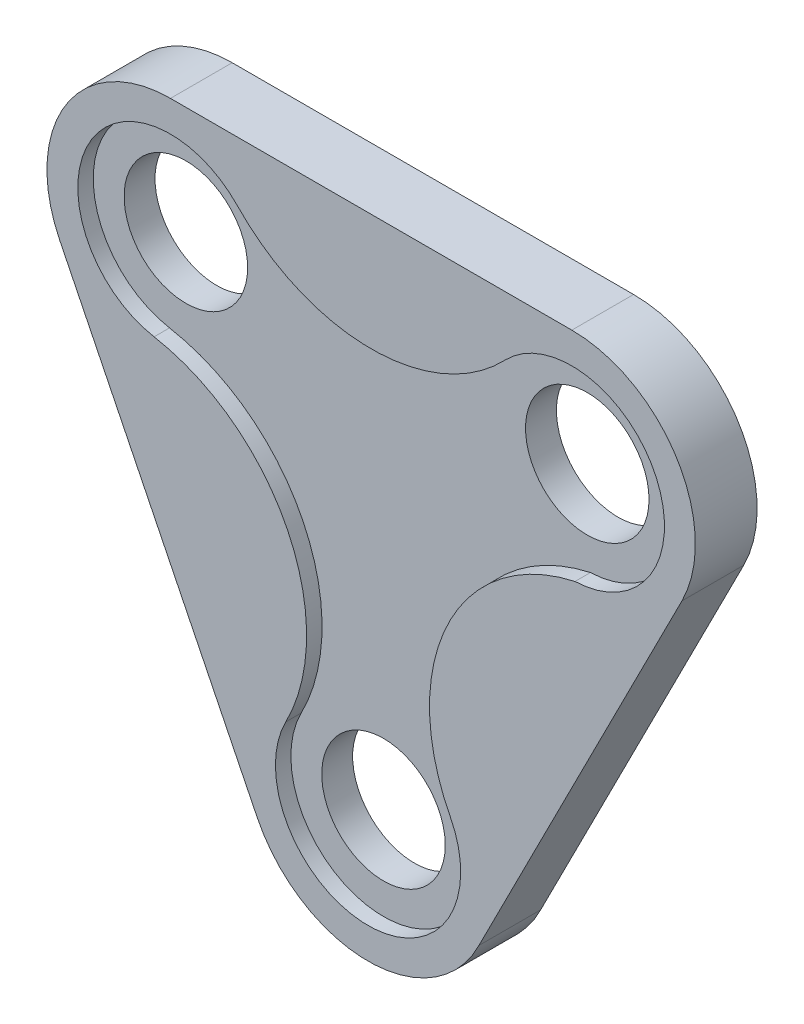
ISO-10303-21;
HEADER;
FILE_DESCRIPTION(('STEP AP214'),'2;1');
FILE_NAME('part.step','',(''),(''),'','','');
FILE_SCHEMA(('AUTOMOTIVE_DESIGN { 1 0 10303 214 1 1 1 1 }'));
ENDSEC;
DATA;
#1=APPLICATION_CONTEXT('core data for automotive mechanical design processes');
#2=APPLICATION_PROTOCOL_DEFINITION('international standard','automotive_design',2000,#1);
#3=PRODUCT_CONTEXT('',#1,'mechanical');
#4=PRODUCT('Part','Part','',(#3));
#5=PRODUCT_RELATED_PRODUCT_CATEGORY('part','',(#4));
#6=PRODUCT_DEFINITION_FORMATION('','',#4);
#7=PRODUCT_DEFINITION_CONTEXT('part definition',#1,'design');
#8=PRODUCT_DEFINITION('design','',#6,#7);
#9=PRODUCT_DEFINITION_SHAPE('','',#8);
#10=(LENGTH_UNIT() NAMED_UNIT(*) SI_UNIT(.MILLI.,.METRE.));
#11=(NAMED_UNIT(*) PLANE_ANGLE_UNIT() SI_UNIT($,.RADIAN.));
#12=(NAMED_UNIT(*) SI_UNIT($,.STERADIAN.) SOLID_ANGLE_UNIT());
#13=UNCERTAINTY_MEASURE_WITH_UNIT(LENGTH_MEASURE(1.E-05),#10,'distance_accuracy_value','');
#14=(GEOMETRIC_REPRESENTATION_CONTEXT(3) GLOBAL_UNCERTAINTY_ASSIGNED_CONTEXT((#13)) GLOBAL_UNIT_ASSIGNED_CONTEXT((#10,
#11,#12)) REPRESENTATION_CONTEXT('',''));
#15=CARTESIAN_POINT('',(0.,0.,0.));
#16=DIRECTION('',(0.,0.,1.));
#17=DIRECTION('',(1.,0.,0.));
#18=AXIS2_PLACEMENT_3D('',#15,#16,#17);
#19=CARTESIAN_POINT('',(33.,65.,5.));
#20=DIRECTION('',(0.,0.,-1.));
#21=DIRECTION('',(-1.,0.,0.));
#22=AXIS2_PLACEMENT_3D('',#19,#20,#21);
#23=CYLINDRICAL_SURFACE('',#22,15.);
#24=DIRECTION('',(0.,0.,-1.));
#25=VECTOR('',#24,1.);
#26=CARTESIAN_POINT('',(33.5117199208429,50.0087311169931,5.));
#27=LINE('',#26,#25);
#28=CARTESIAN_POINT('',(33.5117199208429,50.0087311169931,-2.5));
#29=VERTEX_POINT('',#28);
#30=CARTESIAN_POINT('',(33.5117199208429,50.0087311169931,-5.));
#31=VERTEX_POINT('',#30);
#32=EDGE_CURVE('E199',#29,#31,#27,.T.);
#33=ORIENTED_EDGE('',*,*,#32,.F.);
#34=CARTESIAN_POINT('',(33.,65.,-2.5));
#35=DIRECTION('',(0.,0.,1.));
#36=DIRECTION('',(1.,0.,0.));
#37=AXIS2_PLACEMENT_3D('',#34,#35,#36);
#38=CIRCLE('',#37,15.);
#39=CARTESIAN_POINT('',(22.1666666666667,75.3749163316573,-2.5));
#40=VERTEX_POINT('',#39);
#41=EDGE_CURVE('E355',#29,#40,#38,.T.);
#42=ORIENTED_EDGE('',*,*,#41,.T.);
#43=DIRECTION('',(0.,0.,-1.));
#44=VECTOR('',#43,1.);
#45=CARTESIAN_POINT('',(22.1666666666667,75.3749163316573,5.));
#46=LINE('',#45,#44);
#47=CARTESIAN_POINT('',(22.1666666666667,75.3749163316573,-5.));
#48=VERTEX_POINT('',#47);
#49=EDGE_CURVE('E229',#40,#48,#46,.T.);
#50=ORIENTED_EDGE('',*,*,#49,.T.);
#51=CARTESIAN_POINT('',(33.,65.,-5.));
#52=DIRECTION('',(0.,0.,1.));
#53=DIRECTION('',(1.,0.,0.));
#54=AXIS2_PLACEMENT_3D('',#51,#52,#53);
#55=CIRCLE('',#54,15.);
#56=EDGE_CURVE('E287',#31,#48,#55,.T.);
#57=ORIENTED_EDGE('',*,*,#56,.F.);
#58=EDGE_LOOP('',(#33,#42,#50,#57));
#59=FACE_BOUND('',#58,.T.);
#60=ADVANCED_FACE('F43',(#59),#23,.F.);
#61=CARTESIAN_POINT('',(39.9521048019324,20.7081945590487,5.));
#62=DIRECTION('',(0.,0.,-1.));
#63=DIRECTION('',(-1.,0.,0.));
#64=AXIS2_PLACEMENT_3D('',#61,#62,#63);
#65=CYLINDRICAL_SURFACE('',#64,30.);
#66=CARTESIAN_POINT('',(39.9521048019324,20.7081945590487,-2.5));
#67=DIRECTION('',(0.,0.,1.));
#68=DIRECTION('',(1.,0.,0.));
#69=AXIS2_PLACEMENT_3D('',#66,#67,#68);
#70=CIRCLE('',#69,30.);
#71=CARTESIAN_POINT('',(13.3173682673108,6.90273151968289,-2.5));
#72=VERTEX_POINT('',#71);
#73=EDGE_CURVE('E61',#29,#72,#70,.T.);
#74=ORIENTED_EDGE('',*,*,#73,.F.);
#75=ORIENTED_EDGE('',*,*,#32,.T.);
#76=CARTESIAN_POINT('',(39.9521048019324,20.7081945590487,-5.));
#77=DIRECTION('',(0.,0.,1.));
#78=DIRECTION('',(1.,0.,0.));
#79=AXIS2_PLACEMENT_3D('',#76,#77,#78);
#80=CIRCLE('',#79,30.);
#81=CARTESIAN_POINT('',(13.3173682673108,6.90273151968289,-5.));
#82=VERTEX_POINT('',#81);
#83=EDGE_CURVE('E284',#31,#82,#80,.T.);
#84=ORIENTED_EDGE('',*,*,#83,.T.);
#85=DIRECTION('',(0.,0.,-1.));
#86=VECTOR('',#85,1.);
#87=CARTESIAN_POINT('',(13.3173682673108,6.90273151968289,5.));
#88=LINE('',#87,#86);
#89=EDGE_CURVE('E208',#72,#82,#88,.T.);
#90=ORIENTED_EDGE('',*,*,#89,.F.);
#91=EDGE_LOOP('',(#74,#75,#84,#90));
#92=FACE_BOUND('',#91,.T.);
#93=ADVANCED_FACE('F406',(#92),#65,.T.);
#94=CARTESIAN_POINT('',(0.,0.,5.));
#95=DIRECTION('',(0.,0.,-1.));
#96=DIRECTION('',(-1.,0.,0.));
#97=AXIS2_PLACEMENT_3D('',#94,#95,#96);
#98=CYLINDRICAL_SURFACE('',#97,15.);
#99=DIRECTION('',(0.,0.,-1.));
#100=VECTOR('',#99,1.);
#101=CARTESIAN_POINT('',(-13.3173682673108,6.9027315196829,5.));
#102=LINE('',#101,#100);
#103=CARTESIAN_POINT('',(-13.3173682673108,6.9027315196829,-2.5));
#104=VERTEX_POINT('',#103);
#105=CARTESIAN_POINT('',(-13.3173682673108,6.9027315196829,-5.));
#106=VERTEX_POINT('',#105);
#107=EDGE_CURVE('E217',#104,#106,#102,.T.);
#108=ORIENTED_EDGE('',*,*,#107,.F.);
#109=CARTESIAN_POINT('',(0.,0.,-2.5));
#110=DIRECTION('',(0.,0.,1.));
#111=DIRECTION('',(1.,0.,0.));
#112=AXIS2_PLACEMENT_3D('',#109,#110,#111);
#113=CIRCLE('',#112,15.);
#114=EDGE_CURVE('E69',#104,#72,#113,.T.);
#115=ORIENTED_EDGE('',*,*,#114,.T.);
#116=ORIENTED_EDGE('',*,*,#89,.T.);
#117=CARTESIAN_POINT('',(0.,0.,-5.));
#118=DIRECTION('',(0.,0.,1.));
#119=DIRECTION('',(1.,0.,0.));
#120=AXIS2_PLACEMENT_3D('',#117,#118,#119);
#121=CIRCLE('',#120,15.);
#122=EDGE_CURVE('E280',#106,#82,#121,.T.);
#123=ORIENTED_EDGE('',*,*,#122,.F.);
#124=EDGE_LOOP('',(#108,#115,#116,#123));
#125=FACE_BOUND('',#124,.T.);
#126=ADVANCED_FACE('F399',(#125),#98,.F.);
#127=CARTESIAN_POINT('',(-39.9521048019324,20.7081945590487,5.));
#128=DIRECTION('',(0.,0.,-1.));
#129=DIRECTION('',(-1.,0.,0.));
#130=AXIS2_PLACEMENT_3D('',#127,#128,#129);
#131=CYLINDRICAL_SURFACE('',#130,30.);
#132=DIRECTION('',(0.,0.,-1.));
#133=VECTOR('',#132,1.);
#134=CARTESIAN_POINT('',(-34.6507016006441,50.2360648530162,5.));
#135=LINE('',#134,#133);
#136=CARTESIAN_POINT('',(-34.6507016006441,50.2360648530162,-2.5));
#137=VERTEX_POINT('',#136);
#138=CARTESIAN_POINT('',(-34.6507016006441,50.2360648530162,-5.));
#139=VERTEX_POINT('',#138);
#140=EDGE_CURVE('E222',#137,#139,#135,.T.);
#141=ORIENTED_EDGE('',*,*,#140,.F.);
#142=CARTESIAN_POINT('',(-39.9521048019324,20.7081945590487,-2.5));
#143=DIRECTION('',(0.,0.,1.));
#144=DIRECTION('',(1.,0.,0.));
#145=AXIS2_PLACEMENT_3D('',#142,#143,#144);
#146=CIRCLE('',#145,30.);
#147=EDGE_CURVE('E345',#137,#104,#146,.F.);
#148=ORIENTED_EDGE('',*,*,#147,.T.);
#149=ORIENTED_EDGE('',*,*,#107,.T.);
#150=CARTESIAN_POINT('',(-39.9521048019324,20.7081945590487,-5.));
#151=DIRECTION('',(0.,0.,1.));
#152=DIRECTION('',(1.,0.,0.));
#153=AXIS2_PLACEMENT_3D('',#150,#151,#152);
#154=CIRCLE('',#153,30.);
#155=EDGE_CURVE('E276',#139,#106,#154,.F.);
#156=ORIENTED_EDGE('',*,*,#155,.F.);
#157=EDGE_LOOP('',(#141,#148,#149,#156));
#158=FACE_BOUND('',#157,.T.);
#159=ADVANCED_FACE('F405',(#158),#131,.T.);
#160=CARTESIAN_POINT('',(-32.,65.,5.));
#161=DIRECTION('',(0.,0.,-1.));
#162=DIRECTION('',(-1.,0.,0.));
#163=AXIS2_PLACEMENT_3D('',#160,#161,#162);
#164=CYLINDRICAL_SURFACE('',#163,15.);
#165=DIRECTION('',(0.,0.,-1.));
#166=VECTOR('',#165,1.);
#167=CARTESIAN_POINT('',(-21.1666666666667,75.3749163316573,5.));
#168=LINE('',#167,#166);
#169=CARTESIAN_POINT('',(-21.1666666666667,75.3749163316573,-2.5));
#170=VERTEX_POINT('',#169);
#171=CARTESIAN_POINT('',(-21.1666666666667,75.3749163316573,-5.));
#172=VERTEX_POINT('',#171);
#173=EDGE_CURVE('E227',#170,#172,#168,.T.);
#174=ORIENTED_EDGE('',*,*,#173,.F.);
#175=CARTESIAN_POINT('',(-32.,65.,-2.5));
#176=DIRECTION('',(0.,0.,1.));
#177=DIRECTION('',(1.,0.,0.));
#178=AXIS2_PLACEMENT_3D('',#175,#176,#177);
#179=CIRCLE('',#178,15.);
#180=EDGE_CURVE('E348',#170,#137,#179,.T.);
#181=ORIENTED_EDGE('',*,*,#180,.T.);
#182=ORIENTED_EDGE('',*,*,#140,.T.);
#183=CARTESIAN_POINT('',(-32.,65.,-5.));
#184=DIRECTION('',(0.,0.,1.));
#185=DIRECTION('',(1.,0.,0.));
#186=AXIS2_PLACEMENT_3D('',#183,#184,#185);
#187=CIRCLE('',#186,15.);
#188=EDGE_CURVE('E272',#172,#139,#187,.T.);
#189=ORIENTED_EDGE('',*,*,#188,.F.);
#190=EDGE_LOOP('',(#174,#181,#182,#189));
#191=FACE_BOUND('',#190,.T.);
#192=ADVANCED_FACE('F447',(#191),#164,.F.);
#193=CARTESIAN_POINT('',(0.5,96.1247489949718,5.));
#194=DIRECTION('',(0.,0.,-1.));
#195=DIRECTION('',(-1.,0.,0.));
#196=AXIS2_PLACEMENT_3D('',#193,#194,#195);
#197=CYLINDRICAL_SURFACE('',#196,30.);
#198=CARTESIAN_POINT('',(0.5,96.1247489949718,-2.5));
#199=DIRECTION('',(0.,0.,1.));
#200=DIRECTION('',(1.,0.,0.));
#201=AXIS2_PLACEMENT_3D('',#198,#199,#200);
#202=CIRCLE('',#201,30.);
#203=EDGE_CURVE('E351',#170,#40,#202,.T.);
#204=ORIENTED_EDGE('',*,*,#203,.F.);
#205=ORIENTED_EDGE('',*,*,#173,.T.);
#206=CARTESIAN_POINT('',(0.5,96.1247489949718,-5.));
#207=DIRECTION('',(0.,0.,1.));
#208=DIRECTION('',(1.,0.,0.));
#209=AXIS2_PLACEMENT_3D('',#206,#207,#208);
#210=CIRCLE('',#209,30.);
#211=EDGE_CURVE('E268',#172,#48,#210,.T.);
#212=ORIENTED_EDGE('',*,*,#211,.T.);
#213=ORIENTED_EDGE('',*,*,#49,.F.);
#214=EDGE_LOOP('',(#204,#205,#212,#213));
#215=FACE_BOUND('',#214,.T.);
#216=ADVANCED_FACE('F442',(#215),#197,.T.);
#217=CARTESIAN_POINT('',(-17.9434135208108,-8.833680502553,5.));
#218=DIRECTION('',(-0.897170676040539,-0.44168402512765,0.));
#219=DIRECTION('',(0.44168402512765,-0.897170676040539,0.));
#220=AXIS2_PLACEMENT_3D('',#217,#218,#219);
#221=PLANE('',#220);
#222=DIRECTION('',(-0.44168402512765,0.897170676040539,0.));
#223=VECTOR('',#222,1.);
#224=CARTESIAN_POINT('',(-17.9434135208108,-8.833680502553,-5.));
#225=LINE('',#224,#223);
#226=CARTESIAN_POINT('',(-17.9434135208108,-8.833680502553,-5.));
#227=VERTEX_POINT('',#226);
#228=CARTESIAN_POINT('',(-49.9434135208108,56.166319497447,-5.));
#229=VERTEX_POINT('',#228);
#230=EDGE_CURVE('E264',#227,#229,#225,.T.);
#231=ORIENTED_EDGE('',*,*,#230,.F.);
#232=DIRECTION('',(0.,0.,-1.));
#233=VECTOR('',#232,1.);
#234=CARTESIAN_POINT('',(-17.9434135208108,-8.833680502553,5.));
#235=LINE('',#234,#233);
#236=CARTESIAN_POINT('',(-17.9434135208108,-8.833680502553,5.));
#237=VERTEX_POINT('',#236);
#238=EDGE_CURVE('E11',#237,#227,#235,.T.);
#239=ORIENTED_EDGE('',*,*,#238,.F.);
#240=DIRECTION('',(-0.44168402512765,0.897170676040539,0.));
#241=VECTOR('',#240,1.);
#242=CARTESIAN_POINT('',(-17.9434135208108,-8.833680502553,5.));
#243=LINE('',#242,#241);
#244=CARTESIAN_POINT('',(-49.9434135208108,56.166319497447,5.));
#245=VERTEX_POINT('',#244);
#246=EDGE_CURVE('E310',#237,#245,#243,.T.);
#247=ORIENTED_EDGE('',*,*,#246,.T.);
#248=DIRECTION('',(0.,0.,-1.));
#249=VECTOR('',#248,1.);
#250=CARTESIAN_POINT('',(-49.9434135208108,56.166319497447,5.));
#251=LINE('',#250,#249);
#252=EDGE_CURVE('E198',#245,#229,#251,.T.);
#253=ORIENTED_EDGE('',*,*,#252,.T.);
#254=EDGE_LOOP('',(#231,#239,#247,#253));
#255=FACE_BOUND('',#254,.T.);
#256=ADVANCED_FACE('F438',(#255),#221,.T.);
#257=CARTESIAN_POINT('',(0.,0.,5.));
#258=DIRECTION('',(0.,0.,-1.));
#259=DIRECTION('',(-1.,0.,0.));
#260=AXIS2_PLACEMENT_3D('',#257,#258,#259);
#261=CYLINDRICAL_SURFACE('',#260,20.);
#262=CARTESIAN_POINT('',(0.,0.,-5.));
#263=DIRECTION('',(0.,0.,1.));
#264=DIRECTION('',(1.,0.,0.));
#265=AXIS2_PLACEMENT_3D('',#262,#263,#264);
#266=CIRCLE('',#265,20.);
#267=CARTESIAN_POINT('',(17.9434135208108,-8.833680502553,-5.));
#268=VERTEX_POINT('',#267);
#269=EDGE_CURVE('E260',#227,#268,#266,.T.);
#270=ORIENTED_EDGE('',*,*,#269,.T.);
#271=DIRECTION('',(0.,0.,-1.));
#272=VECTOR('',#271,1.);
#273=CARTESIAN_POINT('',(17.9434135208108,-8.833680502553,5.));
#274=LINE('',#273,#272);
#275=CARTESIAN_POINT('',(17.9434135208108,-8.833680502553,5.));
#276=VERTEX_POINT('',#275);
#277=EDGE_CURVE('E53',#276,#268,#274,.T.);
#278=ORIENTED_EDGE('',*,*,#277,.F.);
#279=CARTESIAN_POINT('',(0.,0.,5.));
#280=DIRECTION('',(0.,0.,1.));
#281=DIRECTION('',(1.,0.,0.));
#282=AXIS2_PLACEMENT_3D('',#279,#280,#281);
#283=CIRCLE('',#282,20.);
#284=EDGE_CURVE('E306',#237,#276,#283,.T.);
#285=ORIENTED_EDGE('',*,*,#284,.F.);
#286=ORIENTED_EDGE('',*,*,#238,.T.);
#287=EDGE_LOOP('',(#270,#278,#285,#286));
#288=FACE_BOUND('',#287,.T.);
#289=ADVANCED_FACE('F434',(#288),#261,.T.);
#290=CARTESIAN_POINT('',(17.8317913786705,-9.0535309415407,5.));
#291=DIRECTION('',(-0.891657330463824,0.452710950861725,0.));
#292=DIRECTION('',(-0.452710950861725,-0.891657330463824,0.));
#293=AXIS2_PLACEMENT_3D('',#290,#291,#292);
#294=PLANE('',#293);
#295=DIRECTION('',(0.452710950861725,0.891657330463824,0.));
#296=VECTOR('',#295,1.);
#297=CARTESIAN_POINT('',(17.8317913786705,-9.0535309415407,-5.));
#298=LINE('',#297,#296);
#299=CARTESIAN_POINT('',(50.8331466092765,55.9457809827655,-5.));
#300=VERTEX_POINT('',#299);
#301=EDGE_CURVE('E256',#268,#300,#298,.T.);
#302=ORIENTED_EDGE('',*,*,#301,.T.);
#303=DIRECTION('',(0.,0.,-1.));
#304=VECTOR('',#303,1.);
#305=CARTESIAN_POINT('',(50.8331466092765,55.9457809827655,5.));
#306=LINE('',#305,#304);
#307=CARTESIAN_POINT('',(50.8331466092765,55.9457809827655,5.));
#308=VERTEX_POINT('',#307);
#309=EDGE_CURVE('E234',#308,#300,#306,.T.);
#310=ORIENTED_EDGE('',*,*,#309,.F.);
#311=DIRECTION('',(0.452710950861725,0.891657330463824,0.));
#312=VECTOR('',#311,1.);
#313=CARTESIAN_POINT('',(17.8317913786705,-9.0535309415407,5.));
#314=LINE('',#313,#312);
#315=EDGE_CURVE('E302',#276,#308,#314,.T.);
#316=ORIENTED_EDGE('',*,*,#315,.F.);
#317=ORIENTED_EDGE('',*,*,#277,.T.);
#318=EDGE_LOOP('',(#302,#310,#316,#317));
#319=FACE_BOUND('',#318,.T.);
#320=ADVANCED_FACE('F424',(#319),#294,.F.);
#321=CARTESIAN_POINT('',(33.,65.,5.));
#322=DIRECTION('',(0.,0.,-1.));
#323=DIRECTION('',(-1.,0.,0.));
#324=AXIS2_PLACEMENT_3D('',#321,#322,#323);
#325=CYLINDRICAL_SURFACE('',#324,20.);
#326=CARTESIAN_POINT('',(33.,65.,-5.));
#327=DIRECTION('',(0.,0.,1.));
#328=DIRECTION('',(1.,0.,0.));
#329=AXIS2_PLACEMENT_3D('',#326,#327,#328);
#330=CIRCLE('',#329,20.);
#331=CARTESIAN_POINT('',(33.,85.,-5.));
#332=VERTEX_POINT('',#331);
#333=EDGE_CURVE('E252',#300,#332,#330,.T.);
#334=ORIENTED_EDGE('',*,*,#333,.T.);
#335=DIRECTION('',(0.,0.,-1.));
#336=VECTOR('',#335,1.);
#337=CARTESIAN_POINT('',(33.,85.,5.));
#338=LINE('',#337,#336);
#339=CARTESIAN_POINT('',(33.,85.,5.));
#340=VERTEX_POINT('',#339);
#341=EDGE_CURVE('E238',#340,#332,#338,.T.);
#342=ORIENTED_EDGE('',*,*,#341,.F.);
#343=CARTESIAN_POINT('',(33.,65.,5.));
#344=DIRECTION('',(0.,0.,1.));
#345=DIRECTION('',(1.,0.,0.));
#346=AXIS2_PLACEMENT_3D('',#343,#344,#345);
#347=CIRCLE('',#346,20.);
#348=EDGE_CURVE('E299',#308,#340,#347,.T.);
#349=ORIENTED_EDGE('',*,*,#348,.F.);
#350=ORIENTED_EDGE('',*,*,#309,.T.);
#351=EDGE_LOOP('',(#334,#342,#349,#350));
#352=FACE_BOUND('',#351,.T.);
#353=ADVANCED_FACE('F418',(#352),#325,.T.);
#354=CARTESIAN_POINT('',(0.,85.,5.));
#355=DIRECTION('',(0.,1.,0.));
#356=DIRECTION('',(-1.,0.,0.));
#357=AXIS2_PLACEMENT_3D('',#354,#355,#356);
#358=PLANE('',#357);
#359=DIRECTION('',(1.,0.,0.));
#360=VECTOR('',#359,1.);
#361=CARTESIAN_POINT('',(0.,85.,-5.));
#362=LINE('',#361,#360);
#363=CARTESIAN_POINT('',(-32.,85.,-5.));
#364=VERTEX_POINT('',#363);
#365=EDGE_CURVE('E248',#364,#332,#362,.T.);
#366=ORIENTED_EDGE('',*,*,#365,.F.);
#367=DIRECTION('',(0.,0.,-1.));
#368=VECTOR('',#367,1.);
#369=CARTESIAN_POINT('',(-32.,85.,5.));
#370=LINE('',#369,#368);
#371=CARTESIAN_POINT('',(-32.,85.,5.));
#372=VERTEX_POINT('',#371);
#373=EDGE_CURVE('E202',#372,#364,#370,.T.);
#374=ORIENTED_EDGE('',*,*,#373,.F.);
#375=DIRECTION('',(1.,0.,0.));
#376=VECTOR('',#375,1.);
#377=CARTESIAN_POINT('',(0.,85.,5.));
#378=LINE('',#377,#376);
#379=EDGE_CURVE('E295',#372,#340,#378,.T.);
#380=ORIENTED_EDGE('',*,*,#379,.T.);
#381=ORIENTED_EDGE('',*,*,#341,.T.);
#382=EDGE_LOOP('',(#366,#374,#380,#381));
#383=FACE_BOUND('',#382,.T.);
#384=ADVANCED_FACE('F414',(#383),#358,.T.);
#385=CARTESIAN_POINT('',(33.,65.,2.5));
#386=DIRECTION('',(0.,0.,1.));
#387=DIRECTION('',(1.,0.,0.));
#388=AXIS2_PLACEMENT_3D('',#385,#386,#387);
#389=CIRCLE('',#388,15.);
#390=CARTESIAN_POINT('',(33.5117199208429,50.0087311169931,2.5));
#391=VERTEX_POINT('',#390);
#392=CARTESIAN_POINT('',(22.1666666666667,75.3749163316573,2.5));
#393=VERTEX_POINT('',#392);
#394=EDGE_CURVE('E174',#391,#393,#389,.T.);
#395=ORIENTED_EDGE('',*,*,#394,.F.);
#396=CARTESIAN_POINT('',(33.5117199208429,50.0087311169931,5.));
#397=VERTEX_POINT('',#396);
#398=EDGE_CURVE('E47',#397,#391,#27,.T.);
#399=ORIENTED_EDGE('',*,*,#398,.F.);
#400=CARTESIAN_POINT('',(33.,65.,5.));
#401=DIRECTION('',(0.,0.,1.));
#402=DIRECTION('',(1.,0.,0.));
#403=AXIS2_PLACEMENT_3D('',#400,#401,#402);
#404=CIRCLE('',#403,15.);
#405=CARTESIAN_POINT('',(22.1666666666667,75.3749163316573,5.));
#406=VERTEX_POINT('',#405);
#407=EDGE_CURVE('E247',#397,#406,#404,.T.);
#408=ORIENTED_EDGE('',*,*,#407,.T.);
#409=EDGE_CURVE('E190',#406,#393,#46,.T.);
#410=ORIENTED_EDGE('',*,*,#409,.T.);
#411=EDGE_LOOP('',(#395,#399,#408,#410));
#412=FACE_BOUND('',#411,.T.);
#413=ADVANCED_FACE('F45',(#412),#23,.F.);
#414=ORIENTED_EDGE('',*,*,#398,.T.);
#415=CARTESIAN_POINT('',(39.9521048019324,20.7081945590487,2.5));
#416=DIRECTION('',(0.,0.,1.));
#417=DIRECTION('',(1.,0.,0.));
#418=AXIS2_PLACEMENT_3D('',#415,#416,#417);
#419=CIRCLE('',#418,30.);
#420=CARTESIAN_POINT('',(13.3173682673108,6.90273151968289,2.5));
#421=VERTEX_POINT('',#420);
#422=EDGE_CURVE('E170',#391,#421,#419,.T.);
#423=ORIENTED_EDGE('',*,*,#422,.T.);
#424=CARTESIAN_POINT('',(13.3173682673108,6.90273151968289,5.));
#425=VERTEX_POINT('',#424);
#426=EDGE_CURVE('E204',#425,#421,#88,.T.);
#427=ORIENTED_EDGE('',*,*,#426,.F.);
#428=CARTESIAN_POINT('',(39.9521048019324,20.7081945590487,5.));
#429=DIRECTION('',(0.,0.,1.));
#430=DIRECTION('',(1.,0.,0.));
#431=AXIS2_PLACEMENT_3D('',#428,#429,#430);
#432=CIRCLE('',#431,30.);
#433=EDGE_CURVE('E195',#397,#425,#432,.T.);
#434=ORIENTED_EDGE('',*,*,#433,.F.);
#435=EDGE_LOOP('',(#414,#423,#427,#434));
#436=FACE_BOUND('',#435,.T.);
#437=ADVANCED_FACE('F194',(#436),#65,.T.);
#438=CARTESIAN_POINT('',(0.,0.,2.5));
#439=DIRECTION('',(0.,0.,1.));
#440=DIRECTION('',(1.,0.,0.));
#441=AXIS2_PLACEMENT_3D('',#438,#439,#440);
#442=CIRCLE('',#441,15.);
#443=CARTESIAN_POINT('',(-13.3173682673108,6.9027315196829,2.5));
#444=VERTEX_POINT('',#443);
#445=EDGE_CURVE('E177',#444,#421,#442,.T.);
#446=ORIENTED_EDGE('',*,*,#445,.F.);
#447=CARTESIAN_POINT('',(-13.3173682673108,6.9027315196829,5.));
#448=VERTEX_POINT('',#447);
#449=EDGE_CURVE('E212',#448,#444,#102,.T.);
#450=ORIENTED_EDGE('',*,*,#449,.F.);
#451=CARTESIAN_POINT('',(0.,0.,5.));
#452=DIRECTION('',(0.,0.,1.));
#453=DIRECTION('',(1.,0.,0.));
#454=AXIS2_PLACEMENT_3D('',#451,#452,#453);
#455=CIRCLE('',#454,15.);
#456=EDGE_CURVE('E325',#448,#425,#455,.T.);
#457=ORIENTED_EDGE('',*,*,#456,.T.);
#458=ORIENTED_EDGE('',*,*,#426,.T.);
#459=EDGE_LOOP('',(#446,#450,#457,#458));
#460=FACE_BOUND('',#459,.T.);
#461=ADVANCED_FACE('F396',(#460),#98,.F.);
#462=CARTESIAN_POINT('',(-39.9521048019324,20.7081945590487,2.5));
#463=DIRECTION('',(0.,0.,1.));
#464=DIRECTION('',(1.,0.,0.));
#465=AXIS2_PLACEMENT_3D('',#462,#463,#464);
#466=CIRCLE('',#465,30.);
#467=CARTESIAN_POINT('',(-34.6507016006441,50.2360648530162,2.5));
#468=VERTEX_POINT('',#467);
#469=EDGE_CURVE('E374',#468,#444,#466,.F.);
#470=ORIENTED_EDGE('',*,*,#469,.F.);
#471=CARTESIAN_POINT('',(-34.6507016006441,50.2360648530162,5.));
#472=VERTEX_POINT('',#471);
#473=EDGE_CURVE('E218',#472,#468,#135,.T.);
#474=ORIENTED_EDGE('',*,*,#473,.F.);
#475=CARTESIAN_POINT('',(-39.9521048019324,20.7081945590487,5.));
#476=DIRECTION('',(0.,0.,1.));
#477=DIRECTION('',(1.,0.,0.));
#478=AXIS2_PLACEMENT_3D('',#475,#476,#477);
#479=CIRCLE('',#478,30.);
#480=EDGE_CURVE('E321',#472,#448,#479,.F.);
#481=ORIENTED_EDGE('',*,*,#480,.T.);
#482=ORIENTED_EDGE('',*,*,#449,.T.);
#483=EDGE_LOOP('',(#470,#474,#481,#482));
#484=FACE_BOUND('',#483,.T.);
#485=ADVANCED_FACE('F391',(#484),#131,.T.);
#486=CARTESIAN_POINT('',(-32.,65.,2.5));
#487=DIRECTION('',(0.,0.,1.));
#488=DIRECTION('',(1.,0.,0.));
#489=AXIS2_PLACEMENT_3D('',#486,#487,#488);
#490=CIRCLE('',#489,15.);
#491=CARTESIAN_POINT('',(-21.1666666666667,75.3749163316573,2.5));
#492=VERTEX_POINT('',#491);
#493=EDGE_CURVE('E377',#492,#468,#490,.T.);
#494=ORIENTED_EDGE('',*,*,#493,.F.);
#495=CARTESIAN_POINT('',(-21.1666666666667,75.3749163316573,5.));
#496=VERTEX_POINT('',#495);
#497=EDGE_CURVE('E223',#496,#492,#168,.T.);
#498=ORIENTED_EDGE('',*,*,#497,.F.);
#499=CARTESIAN_POINT('',(-32.,65.,5.));
#500=DIRECTION('',(0.,0.,1.));
#501=DIRECTION('',(1.,0.,0.));
#502=AXIS2_PLACEMENT_3D('',#499,#500,#501);
#503=CIRCLE('',#502,15.);
#504=EDGE_CURVE('E317',#496,#472,#503,.T.);
#505=ORIENTED_EDGE('',*,*,#504,.T.);
#506=ORIENTED_EDGE('',*,*,#473,.T.);
#507=EDGE_LOOP('',(#494,#498,#505,#506));
#508=FACE_BOUND('',#507,.T.);
#509=ADVANCED_FACE('F387',(#508),#164,.F.);
#510=ORIENTED_EDGE('',*,*,#497,.T.);
#511=CARTESIAN_POINT('',(0.5,96.1247489949718,2.5));
#512=DIRECTION('',(0.,0.,1.));
#513=DIRECTION('',(1.,0.,0.));
#514=AXIS2_PLACEMENT_3D('',#511,#512,#513);
#515=CIRCLE('',#514,30.);
#516=EDGE_CURVE('E192',#492,#393,#515,.T.);
#517=ORIENTED_EDGE('',*,*,#516,.T.);
#518=ORIENTED_EDGE('',*,*,#409,.F.);
#519=CARTESIAN_POINT('',(0.5,96.1247489949718,5.));
#520=DIRECTION('',(0.,0.,1.));
#521=DIRECTION('',(1.,0.,0.));
#522=AXIS2_PLACEMENT_3D('',#519,#520,#521);
#523=CIRCLE('',#522,30.);
#524=EDGE_CURVE('E314',#496,#406,#523,.T.);
#525=ORIENTED_EDGE('',*,*,#524,.F.);
#526=EDGE_LOOP('',(#510,#517,#518,#525));
#527=FACE_BOUND('',#526,.T.);
#528=ADVANCED_FACE('F382',(#527),#197,.T.);
#529=CARTESIAN_POINT('',(-32.,65.,5.));
#530=DIRECTION('',(0.,0.,-1.));
#531=DIRECTION('',(-1.,0.,0.));
#532=AXIS2_PLACEMENT_3D('',#529,#530,#531);
#533=CYLINDRICAL_SURFACE('',#532,20.);
#534=CARTESIAN_POINT('',(-32.,65.,-5.));
#535=DIRECTION('',(0.,0.,1.));
#536=DIRECTION('',(1.,0.,0.));
#537=AXIS2_PLACEMENT_3D('',#534,#535,#536);
#538=CIRCLE('',#537,20.);
#539=EDGE_CURVE('E243',#364,#229,#538,.T.);
#540=ORIENTED_EDGE('',*,*,#539,.T.);
#541=ORIENTED_EDGE('',*,*,#252,.F.);
#542=CARTESIAN_POINT('',(-32.,65.,5.));
#543=DIRECTION('',(0.,0.,1.));
#544=DIRECTION('',(1.,0.,0.));
#545=AXIS2_PLACEMENT_3D('',#542,#543,#544);
#546=CIRCLE('',#545,20.);
#547=EDGE_CURVE('E292',#372,#245,#546,.T.);
#548=ORIENTED_EDGE('',*,*,#547,.F.);
#549=ORIENTED_EDGE('',*,*,#373,.T.);
#550=EDGE_LOOP('',(#540,#541,#548,#549));
#551=FACE_BOUND('',#550,.T.);
#552=ADVANCED_FACE('F429',(#551),#533,.T.);
#553=CARTESIAN_POINT('',(0.,0.,5.));
#554=DIRECTION('',(0.,0.,1.));
#555=DIRECTION('',(1.,0.,0.));
#556=AXIS2_PLACEMENT_3D('',#553,#554,#555);
#557=PLANE('',#556);
#558=ORIENTED_EDGE('',*,*,#407,.F.);
#559=ORIENTED_EDGE('',*,*,#433,.T.);
#560=ORIENTED_EDGE('',*,*,#456,.F.);
#561=ORIENTED_EDGE('',*,*,#480,.F.);
#562=ORIENTED_EDGE('',*,*,#504,.F.);
#563=ORIENTED_EDGE('',*,*,#524,.T.);
#564=EDGE_LOOP('',(#558,#559,#560,#561,#562,#563));
#565=FACE_BOUND('',#564,.T.);
#566=ORIENTED_EDGE('',*,*,#246,.F.);
#567=ORIENTED_EDGE('',*,*,#284,.T.);
#568=ORIENTED_EDGE('',*,*,#315,.T.);
#569=ORIENTED_EDGE('',*,*,#348,.T.);
#570=ORIENTED_EDGE('',*,*,#379,.F.);
#571=ORIENTED_EDGE('',*,*,#547,.T.);
#572=EDGE_LOOP('',(#566,#567,#568,#569,#570,#571));
#573=FACE_BOUND('',#572,.T.);
#574=ADVANCED_FACE('F394',(#565,#573),#557,.T.);
#575=CARTESIAN_POINT('',(0.,0.,-5.));
#576=DIRECTION('',(0.,0.,1.));
#577=DIRECTION('',(1.,0.,0.));
#578=AXIS2_PLACEMENT_3D('',#575,#576,#577);
#579=PLANE('',#578);
#580=ORIENTED_EDGE('',*,*,#56,.T.);
#581=ORIENTED_EDGE('',*,*,#211,.F.);
#582=ORIENTED_EDGE('',*,*,#188,.T.);
#583=ORIENTED_EDGE('',*,*,#155,.T.);
#584=ORIENTED_EDGE('',*,*,#122,.T.);
#585=ORIENTED_EDGE('',*,*,#83,.F.);
#586=EDGE_LOOP('',(#580,#581,#582,#583,#584,#585));
#587=FACE_BOUND('',#586,.T.);
#588=ORIENTED_EDGE('',*,*,#230,.T.);
#589=ORIENTED_EDGE('',*,*,#539,.F.);
#590=ORIENTED_EDGE('',*,*,#365,.T.);
#591=ORIENTED_EDGE('',*,*,#333,.F.);
#592=ORIENTED_EDGE('',*,*,#301,.F.);
#593=ORIENTED_EDGE('',*,*,#269,.F.);
#594=EDGE_LOOP('',(#588,#589,#590,#591,#592,#593));
#595=FACE_BOUND('',#594,.T.);
#596=ADVANCED_FACE('F476',(#587,#595),#579,.F.);
#597=CARTESIAN_POINT('',(33.,65.,2.5));
#598=DIRECTION('',(0.,0.,-1.));
#599=DIRECTION('',(-1.,0.,0.));
#600=AXIS2_PLACEMENT_3D('',#597,#598,#599);
#601=CYLINDRICAL_SURFACE('',#600,10.);
#602=CARTESIAN_POINT('',(33.,65.,2.5));
#603=DIRECTION('',(0.,0.,1.));
#604=DIRECTION('',(1.,0.,0.));
#605=AXIS2_PLACEMENT_3D('',#602,#603,#604);
#606=CIRCLE('',#605,10.);
#607=CARTESIAN_POINT('',(43.,65.,2.5));
#608=VERTEX_POINT('',#607);
#609=EDGE_CURVE('E364',#608,#608,#606,.T.);
#610=ORIENTED_EDGE('',*,*,#609,.T.);
#611=EDGE_LOOP('',(#610));
#612=FACE_BOUND('',#611,.T.);
#613=CARTESIAN_POINT('',(33.,65.,-2.5));
#614=DIRECTION('',(0.,0.,1.));
#615=DIRECTION('',(1.,0.,0.));
#616=AXIS2_PLACEMENT_3D('',#613,#614,#615);
#617=CIRCLE('',#616,10.);
#618=CARTESIAN_POINT('',(43.,65.,-2.5));
#619=VERTEX_POINT('',#618);
#620=EDGE_CURVE('E335',#619,#619,#617,.T.);
#621=ORIENTED_EDGE('',*,*,#620,.F.);
#622=EDGE_LOOP('',(#621));
#623=FACE_BOUND('',#622,.T.);
#624=ADVANCED_FACE('F479',(#612,#623),#601,.F.);
#625=CARTESIAN_POINT('',(0.,0.,2.5));
#626=DIRECTION('',(0.,0.,-1.));
#627=DIRECTION('',(-1.,0.,0.));
#628=AXIS2_PLACEMENT_3D('',#625,#626,#627);
#629=CYLINDRICAL_SURFACE('',#628,10.);
#630=CARTESIAN_POINT('',(0.,0.,2.5));
#631=DIRECTION('',(0.,0.,1.));
#632=DIRECTION('',(1.,0.,0.));
#633=AXIS2_PLACEMENT_3D('',#630,#631,#632);
#634=CIRCLE('',#633,10.);
#635=CARTESIAN_POINT('',(10.,0.,2.5));
#636=VERTEX_POINT('',#635);
#637=EDGE_CURVE('E368',#636,#636,#634,.T.);
#638=ORIENTED_EDGE('',*,*,#637,.T.);
#639=EDGE_LOOP('',(#638));
#640=FACE_BOUND('',#639,.T.);
#641=CARTESIAN_POINT('',(0.,0.,-2.5));
#642=DIRECTION('',(0.,0.,1.));
#643=DIRECTION('',(1.,0.,0.));
#644=AXIS2_PLACEMENT_3D('',#641,#642,#643);
#645=CIRCLE('',#644,10.);
#646=CARTESIAN_POINT('',(10.,0.,-2.5));
#647=VERTEX_POINT('',#646);
#648=EDGE_CURVE('E339',#647,#647,#645,.T.);
#649=ORIENTED_EDGE('',*,*,#648,.F.);
#650=EDGE_LOOP('',(#649));
#651=FACE_BOUND('',#650,.T.);
#652=ADVANCED_FACE('F498',(#640,#651),#629,.F.);
#653=CARTESIAN_POINT('',(-32.,65.,2.5));
#654=DIRECTION('',(0.,0.,-1.));
#655=DIRECTION('',(-1.,0.,0.));
#656=AXIS2_PLACEMENT_3D('',#653,#654,#655);
#657=CYLINDRICAL_SURFACE('',#656,10.);
#658=CARTESIAN_POINT('',(-32.,65.,2.5));
#659=DIRECTION('',(0.,0.,1.));
#660=DIRECTION('',(1.,0.,0.));
#661=AXIS2_PLACEMENT_3D('',#658,#659,#660);
#662=CIRCLE('',#661,10.);
#663=CARTESIAN_POINT('',(-22.,65.,2.5));
#664=VERTEX_POINT('',#663);
#665=EDGE_CURVE('E291',#664,#664,#662,.T.);
#666=ORIENTED_EDGE('',*,*,#665,.T.);
#667=EDGE_LOOP('',(#666));
#668=FACE_BOUND('',#667,.T.);
#669=CARTESIAN_POINT('',(-32.,65.,-2.5));
#670=DIRECTION('',(0.,0.,1.));
#671=DIRECTION('',(1.,0.,0.));
#672=AXIS2_PLACEMENT_3D('',#669,#670,#671);
#673=CIRCLE('',#672,10.);
#674=CARTESIAN_POINT('',(-22.,65.,-2.5));
#675=VERTEX_POINT('',#674);
#676=EDGE_CURVE('E183',#675,#675,#673,.T.);
#677=ORIENTED_EDGE('',*,*,#676,.F.);
#678=EDGE_LOOP('',(#677));
#679=FACE_BOUND('',#678,.T.);
#680=ADVANCED_FACE('F501',(#668,#679),#657,.F.);
#681=CARTESIAN_POINT('',(0.,0.,2.5));
#682=DIRECTION('',(0.,0.,1.));
#683=DIRECTION('',(1.,0.,0.));
#684=AXIS2_PLACEMENT_3D('',#681,#682,#683);
#685=PLANE('',#684);
#686=ORIENTED_EDGE('',*,*,#422,.F.);
#687=ORIENTED_EDGE('',*,*,#394,.T.);
#688=ORIENTED_EDGE('',*,*,#516,.F.);
#689=ORIENTED_EDGE('',*,*,#493,.T.);
#690=ORIENTED_EDGE('',*,*,#469,.T.);
#691=ORIENTED_EDGE('',*,*,#445,.T.);
#692=EDGE_LOOP('',(#686,#687,#688,#689,#690,#691));
#693=FACE_BOUND('',#692,.T.);
#694=ORIENTED_EDGE('',*,*,#637,.F.);
#695=EDGE_LOOP('',(#694));
#696=FACE_BOUND('',#695,.T.);
#697=ORIENTED_EDGE('',*,*,#609,.F.);
#698=EDGE_LOOP('',(#697));
#699=FACE_BOUND('',#698,.T.);
#700=ORIENTED_EDGE('',*,*,#665,.F.);
#701=EDGE_LOOP('',(#700));
#702=FACE_BOUND('',#701,.T.);
#703=ADVANCED_FACE('F172',(#693,#696,#699,#702),#685,.T.);
#704=CARTESIAN_POINT('',(0.,0.,-2.5));
#705=DIRECTION('',(0.,0.,1.));
#706=DIRECTION('',(1.,0.,0.));
#707=AXIS2_PLACEMENT_3D('',#704,#705,#706);
#708=PLANE('',#707);
#709=ORIENTED_EDGE('',*,*,#73,.T.);
#710=ORIENTED_EDGE('',*,*,#114,.F.);
#711=ORIENTED_EDGE('',*,*,#147,.F.);
#712=ORIENTED_EDGE('',*,*,#180,.F.);
#713=ORIENTED_EDGE('',*,*,#203,.T.);
#714=ORIENTED_EDGE('',*,*,#41,.F.);
#715=EDGE_LOOP('',(#709,#710,#711,#712,#713,#714));
#716=FACE_BOUND('',#715,.T.);
#717=ORIENTED_EDGE('',*,*,#648,.T.);
#718=EDGE_LOOP('',(#717));
#719=FACE_BOUND('',#718,.T.);
#720=ORIENTED_EDGE('',*,*,#620,.T.);
#721=EDGE_LOOP('',(#720));
#722=FACE_BOUND('',#721,.T.);
#723=ORIENTED_EDGE('',*,*,#676,.T.);
#724=EDGE_LOOP('',(#723));
#725=FACE_BOUND('',#724,.T.);
#726=ADVANCED_FACE('F466',(#716,#719,#722,#725),#708,.F.);
#727=CLOSED_SHELL('',(#60,#93,#126,#159,#192,#216,#256,#289,#320,#353,#384,#413,#437,#461,#485,
#509,#528,#552,#574,#596,#624,#652,#680,#703,#726));
#728=MANIFOLD_SOLID_BREP('B2',#727);
#729=ADVANCED_BREP_SHAPE_REPRESENTATION('',(#18,#728),#14);
#730=SHAPE_DEFINITION_REPRESENTATION(#9,#729);
ENDSEC;
END-ISO-10303-21;
